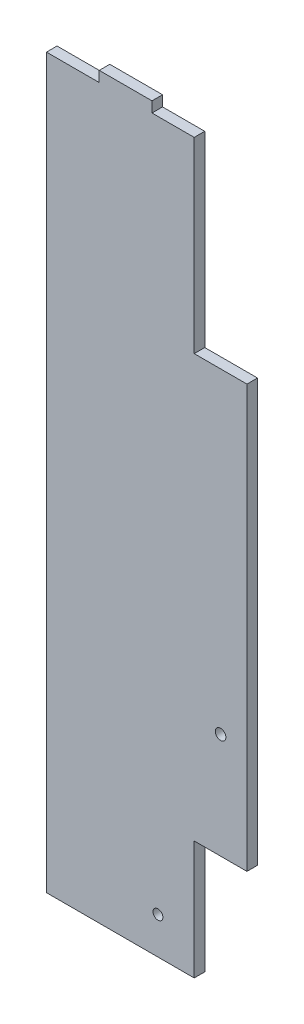
ISO-10303-21;
HEADER;
FILE_DESCRIPTION(('STEP AP214'),'2;1');
FILE_NAME('part.step','',(''),(''),'','','');
FILE_SCHEMA(('AUTOMOTIVE_DESIGN { 1 0 10303 214 1 1 1 1 }'));
ENDSEC;
DATA;
#1=APPLICATION_CONTEXT('core data for automotive mechanical design processes');
#2=APPLICATION_PROTOCOL_DEFINITION('international standard','automotive_design',2000,#1);
#3=PRODUCT_CONTEXT('',#1,'mechanical');
#4=PRODUCT('Part','Part','',(#3));
#5=PRODUCT_RELATED_PRODUCT_CATEGORY('part','',(#4));
#6=PRODUCT_DEFINITION_FORMATION('','',#4);
#7=PRODUCT_DEFINITION_CONTEXT('part definition',#1,'design');
#8=PRODUCT_DEFINITION('design','',#6,#7);
#9=PRODUCT_DEFINITION_SHAPE('','',#8);
#10=(LENGTH_UNIT() NAMED_UNIT(*) SI_UNIT(.MILLI.,.METRE.));
#11=(NAMED_UNIT(*) PLANE_ANGLE_UNIT() SI_UNIT($,.RADIAN.));
#12=(NAMED_UNIT(*) SI_UNIT($,.STERADIAN.) SOLID_ANGLE_UNIT());
#13=UNCERTAINTY_MEASURE_WITH_UNIT(LENGTH_MEASURE(1.E-05),#10,'distance_accuracy_value','');
#14=(GEOMETRIC_REPRESENTATION_CONTEXT(3) GLOBAL_UNCERTAINTY_ASSIGNED_CONTEXT((#13)) GLOBAL_UNIT_ASSIGNED_CONTEXT((#10,
#11,#12)) REPRESENTATION_CONTEXT('',''));
#15=CARTESIAN_POINT('',(0.,0.,0.));
#16=DIRECTION('',(0.,0.,1.));
#17=DIRECTION('',(1.,0.,0.));
#18=AXIS2_PLACEMENT_3D('',#15,#16,#17);
#19=CARTESIAN_POINT('',(0.,136.,4.));
#20=DIRECTION('',(0.,1.,0.));
#21=DIRECTION('',(-1.,0.,0.));
#22=AXIS2_PLACEMENT_3D('',#19,#20,#21);
#23=PLANE('',#22);
#24=DIRECTION('',(1.,0.,0.));
#25=VECTOR('',#24,1.);
#26=CARTESIAN_POINT('',(0.,136.,0.));
#27=LINE('',#26,#25);
#28=CARTESIAN_POINT('',(-40.,136.,0.));
#29=VERTEX_POINT('',#28);
#30=CARTESIAN_POINT('',(-20.,136.,0.));
#31=VERTEX_POINT('',#30);
#32=EDGE_CURVE('E109',#29,#31,#27,.T.);
#33=ORIENTED_EDGE('',*,*,#32,.F.);
#34=DIRECTION('',(0.,0.,-1.));
#35=VECTOR('',#34,1.);
#36=CARTESIAN_POINT('',(-40.,136.,4.));
#37=LINE('',#36,#35);
#38=CARTESIAN_POINT('',(-40.,136.,4.));
#39=VERTEX_POINT('',#38);
#40=EDGE_CURVE('E45',#39,#29,#37,.T.);
#41=ORIENTED_EDGE('',*,*,#40,.F.);
#42=DIRECTION('',(1.,0.,0.));
#43=VECTOR('',#42,1.);
#44=CARTESIAN_POINT('',(0.,136.,4.));
#45=LINE('',#44,#43);
#46=CARTESIAN_POINT('',(-20.,136.,4.));
#47=VERTEX_POINT('',#46);
#48=EDGE_CURVE('E223',#39,#47,#45,.T.);
#49=ORIENTED_EDGE('',*,*,#48,.T.);
#50=DIRECTION('',(0.,0.,-1.));
#51=VECTOR('',#50,1.);
#52=CARTESIAN_POINT('',(-20.,136.,4.));
#53=LINE('',#52,#51);
#54=EDGE_CURVE('E160',#47,#31,#53,.T.);
#55=ORIENTED_EDGE('',*,*,#54,.T.);
#56=EDGE_LOOP('',(#33,#41,#49,#55));
#57=FACE_BOUND('',#56,.T.);
#58=ADVANCED_FACE('F41',(#57),#23,.T.);
#59=CARTESIAN_POINT('',(0.,-140.,4.));
#60=DIRECTION('',(0.,-1.,0.));
#61=DIRECTION('',(0.,0.,-1.));
#62=AXIS2_PLACEMENT_3D('',#59,#60,#61);
#63=PLANE('',#62);
#64=DIRECTION('',(-1.,0.,0.));
#65=VECTOR('',#64,1.);
#66=CARTESIAN_POINT('',(0.,-140.,0.));
#67=LINE('',#66,#65);
#68=CARTESIAN_POINT('',(16.0000000000001,-140.,0.));
#69=VERTEX_POINT('',#68);
#70=CARTESIAN_POINT('',(-39.9999999999999,-140.,0.));
#71=VERTEX_POINT('',#70);
#72=EDGE_CURVE('E115',#69,#71,#67,.T.);
#73=ORIENTED_EDGE('',*,*,#72,.F.);
#74=DIRECTION('',(0.,0.,-1.));
#75=VECTOR('',#74,1.);
#76=CARTESIAN_POINT('',(16.0000000000001,-140.,4.));
#77=LINE('',#76,#75);
#78=CARTESIAN_POINT('',(16.0000000000001,-140.,4.));
#79=VERTEX_POINT('',#78);
#80=EDGE_CURVE('E11',#79,#69,#77,.T.);
#81=ORIENTED_EDGE('',*,*,#80,.F.);
#82=DIRECTION('',(-1.,0.,0.));
#83=VECTOR('',#82,1.);
#84=CARTESIAN_POINT('',(0.,-140.,4.));
#85=LINE('',#84,#83);
#86=CARTESIAN_POINT('',(-39.9999999999999,-140.,4.));
#87=VERTEX_POINT('',#86);
#88=EDGE_CURVE('E131',#79,#87,#85,.T.);
#89=ORIENTED_EDGE('',*,*,#88,.T.);
#90=DIRECTION('',(0.,0.,-1.));
#91=VECTOR('',#90,1.);
#92=CARTESIAN_POINT('',(-39.9999999999999,-140.,4.));
#93=LINE('',#92,#91);
#94=EDGE_CURVE('E128',#87,#71,#93,.T.);
#95=ORIENTED_EDGE('',*,*,#94,.T.);
#96=EDGE_LOOP('',(#73,#81,#89,#95));
#97=FACE_BOUND('',#96,.T.);
#98=ADVANCED_FACE('F129',(#97),#63,.T.);
#99=CARTESIAN_POINT('',(16.,0.,4.));
#100=DIRECTION('',(1.,0.,0.));
#101=DIRECTION('',(0.,1.,0.));
#102=AXIS2_PLACEMENT_3D('',#99,#100,#101);
#103=PLANE('',#102);
#104=DIRECTION('',(0.,-1.,0.));
#105=VECTOR('',#104,1.);
#106=CARTESIAN_POINT('',(16.,0.,0.));
#107=LINE('',#106,#105);
#108=CARTESIAN_POINT('',(16.,-95.,0.));
#109=VERTEX_POINT('',#108);
#110=EDGE_CURVE('E123',#109,#69,#107,.T.);
#111=ORIENTED_EDGE('',*,*,#110,.F.);
#112=DIRECTION('',(0.,0.,-1.));
#113=VECTOR('',#112,1.);
#114=CARTESIAN_POINT('',(16.,-95.,4.));
#115=LINE('',#114,#113);
#116=CARTESIAN_POINT('',(16.,-95.,4.));
#117=VERTEX_POINT('',#116);
#118=EDGE_CURVE('E51',#117,#109,#115,.T.);
#119=ORIENTED_EDGE('',*,*,#118,.F.);
#120=DIRECTION('',(0.,-1.,0.));
#121=VECTOR('',#120,1.);
#122=CARTESIAN_POINT('',(16.,0.,4.));
#123=LINE('',#122,#121);
#124=EDGE_CURVE('E219',#117,#79,#123,.T.);
#125=ORIENTED_EDGE('',*,*,#124,.T.);
#126=ORIENTED_EDGE('',*,*,#80,.T.);
#127=EDGE_LOOP('',(#111,#119,#125,#126));
#128=FACE_BOUND('',#127,.T.);
#129=ADVANCED_FACE('F250',(#128),#103,.T.);
#130=CARTESIAN_POINT('',(0.,-95.,4.));
#131=DIRECTION('',(0.,1.,0.));
#132=DIRECTION('',(0.,0.,1.));
#133=AXIS2_PLACEMENT_3D('',#130,#131,#132);
#134=PLANE('',#133);
#135=DIRECTION('',(1.,0.,0.));
#136=VECTOR('',#135,1.);
#137=CARTESIAN_POINT('',(0.,-95.,0.));
#138=LINE('',#137,#136);
#139=CARTESIAN_POINT('',(36.,-95.,0.));
#140=VERTEX_POINT('',#139);
#141=EDGE_CURVE('E184',#109,#140,#138,.T.);
#142=ORIENTED_EDGE('',*,*,#141,.T.);
#143=DIRECTION('',(0.,0.,-1.));
#144=VECTOR('',#143,1.);
#145=CARTESIAN_POINT('',(36.,-95.,4.));
#146=LINE('',#145,#144);
#147=CARTESIAN_POINT('',(36.,-95.,4.));
#148=VERTEX_POINT('',#147);
#149=EDGE_CURVE('E143',#148,#140,#146,.T.);
#150=ORIENTED_EDGE('',*,*,#149,.F.);
#151=DIRECTION('',(1.,0.,0.));
#152=VECTOR('',#151,1.);
#153=CARTESIAN_POINT('',(0.,-95.,4.));
#154=LINE('',#153,#152);
#155=EDGE_CURVE('E216',#117,#148,#154,.T.);
#156=ORIENTED_EDGE('',*,*,#155,.F.);
#157=ORIENTED_EDGE('',*,*,#118,.T.);
#158=EDGE_LOOP('',(#142,#150,#156,#157));
#159=FACE_BOUND('',#158,.T.);
#160=ADVANCED_FACE('F313',(#159),#134,.F.);
#161=CARTESIAN_POINT('',(36.,0.,4.));
#162=DIRECTION('',(-1.,0.,0.));
#163=DIRECTION('',(0.,0.,1.));
#164=AXIS2_PLACEMENT_3D('',#161,#162,#163);
#165=PLANE('',#164);
#166=DIRECTION('',(0.,1.,0.));
#167=VECTOR('',#166,1.);
#168=CARTESIAN_POINT('',(36.,0.,0.));
#169=LINE('',#168,#167);
#170=CARTESIAN_POINT('',(36.,65.,0.));
#171=VERTEX_POINT('',#170);
#172=EDGE_CURVE('E180',#140,#171,#169,.T.);
#173=ORIENTED_EDGE('',*,*,#172,.T.);
#174=DIRECTION('',(0.,0.,-1.));
#175=VECTOR('',#174,1.);
#176=CARTESIAN_POINT('',(36.,65.,4.));
#177=LINE('',#176,#175);
#178=CARTESIAN_POINT('',(36.,65.,4.));
#179=VERTEX_POINT('',#178);
#180=EDGE_CURVE('E147',#179,#171,#177,.T.);
#181=ORIENTED_EDGE('',*,*,#180,.F.);
#182=DIRECTION('',(0.,1.,0.));
#183=VECTOR('',#182,1.);
#184=CARTESIAN_POINT('',(36.,0.,4.));
#185=LINE('',#184,#183);
#186=EDGE_CURVE('E212',#148,#179,#185,.T.);
#187=ORIENTED_EDGE('',*,*,#186,.F.);
#188=ORIENTED_EDGE('',*,*,#149,.T.);
#189=EDGE_LOOP('',(#173,#181,#187,#188));
#190=FACE_BOUND('',#189,.T.);
#191=ADVANCED_FACE('F317',(#190),#165,.F.);
#192=CARTESIAN_POINT('',(0.,65.,4.));
#193=DIRECTION('',(0.,1.,0.));
#194=DIRECTION('',(0.,0.,1.));
#195=AXIS2_PLACEMENT_3D('',#192,#193,#194);
#196=PLANE('',#195);
#197=DIRECTION('',(1.,0.,0.));
#198=VECTOR('',#197,1.);
#199=CARTESIAN_POINT('',(0.,65.,0.));
#200=LINE('',#199,#198);
#201=CARTESIAN_POINT('',(16.,65.,0.));
#202=VERTEX_POINT('',#201);
#203=EDGE_CURVE('E177',#202,#171,#200,.T.);
#204=ORIENTED_EDGE('',*,*,#203,.F.);
#205=DIRECTION('',(0.,0.,-1.));
#206=VECTOR('',#205,1.);
#207=CARTESIAN_POINT('',(16.,65.,4.));
#208=LINE('',#207,#206);
#209=CARTESIAN_POINT('',(16.,65.,4.));
#210=VERTEX_POINT('',#209);
#211=EDGE_CURVE('E149',#210,#202,#208,.T.);
#212=ORIENTED_EDGE('',*,*,#211,.F.);
#213=DIRECTION('',(1.,0.,0.));
#214=VECTOR('',#213,1.);
#215=CARTESIAN_POINT('',(0.,65.,4.));
#216=LINE('',#215,#214);
#217=EDGE_CURVE('E209',#210,#179,#216,.T.);
#218=ORIENTED_EDGE('',*,*,#217,.T.);
#219=ORIENTED_EDGE('',*,*,#180,.T.);
#220=EDGE_LOOP('',(#204,#212,#218,#219));
#221=FACE_BOUND('',#220,.T.);
#222=ADVANCED_FACE('F320',(#221),#196,.T.);
#223=CARTESIAN_POINT('',(16.,0.,4.));
#224=DIRECTION('',(1.,0.,0.));
#225=DIRECTION('',(0.,1.,0.));
#226=AXIS2_PLACEMENT_3D('',#223,#224,#225);
#227=PLANE('',#226);
#228=DIRECTION('',(0.,-1.,0.));
#229=VECTOR('',#228,1.);
#230=CARTESIAN_POINT('',(16.,0.,0.));
#231=LINE('',#230,#229);
#232=CARTESIAN_POINT('',(16.,136.,0.));
#233=VERTEX_POINT('',#232);
#234=EDGE_CURVE('E173',#233,#202,#231,.T.);
#235=ORIENTED_EDGE('',*,*,#234,.F.);
#236=DIRECTION('',(0.,0.,-1.));
#237=VECTOR('',#236,1.);
#238=CARTESIAN_POINT('',(16.,136.,4.));
#239=LINE('',#238,#237);
#240=CARTESIAN_POINT('',(16.,136.,4.));
#241=VERTEX_POINT('',#240);
#242=EDGE_CURVE('E151',#241,#233,#239,.T.);
#243=ORIENTED_EDGE('',*,*,#242,.F.);
#244=DIRECTION('',(0.,-1.,0.));
#245=VECTOR('',#244,1.);
#246=CARTESIAN_POINT('',(16.,0.,4.));
#247=LINE('',#246,#245);
#248=EDGE_CURVE('E205',#241,#210,#247,.T.);
#249=ORIENTED_EDGE('',*,*,#248,.T.);
#250=ORIENTED_EDGE('',*,*,#211,.T.);
#251=EDGE_LOOP('',(#235,#243,#249,#250));
#252=FACE_BOUND('',#251,.T.);
#253=ADVANCED_FACE('F256',(#252),#227,.T.);
#254=CARTESIAN_POINT('',(0.,136.,0.));
#255=VERTEX_POINT('',#254);
#256=EDGE_CURVE('E172',#255,#233,#27,.T.);
#257=ORIENTED_EDGE('',*,*,#256,.F.);
#258=DIRECTION('',(0.,0.,-1.));
#259=VECTOR('',#258,1.);
#260=CARTESIAN_POINT('',(0.,136.,4.));
#261=LINE('',#260,#259);
#262=CARTESIAN_POINT('',(0.,136.,4.));
#263=VERTEX_POINT('',#262);
#264=EDGE_CURVE('E153',#263,#255,#261,.T.);
#265=ORIENTED_EDGE('',*,*,#264,.F.);
#266=EDGE_CURVE('E204',#263,#241,#45,.T.);
#267=ORIENTED_EDGE('',*,*,#266,.T.);
#268=ORIENTED_EDGE('',*,*,#242,.T.);
#269=EDGE_LOOP('',(#257,#265,#267,#268));
#270=FACE_BOUND('',#269,.T.);
#271=ADVANCED_FACE('F246',(#270),#23,.T.);
#272=CARTESIAN_POINT('',(0.,0.,4.));
#273=DIRECTION('',(1.,0.,0.));
#274=DIRECTION('',(0.,1.,0.));
#275=AXIS2_PLACEMENT_3D('',#272,#273,#274);
#276=PLANE('',#275);
#277=DIRECTION('',(0.,-1.,0.));
#278=VECTOR('',#277,1.);
#279=CARTESIAN_POINT('',(0.,0.,0.));
#280=LINE('',#279,#278);
#281=CARTESIAN_POINT('',(0.,140.,0.));
#282=VERTEX_POINT('',#281);
#283=EDGE_CURVE('E169',#282,#255,#280,.T.);
#284=ORIENTED_EDGE('',*,*,#283,.F.);
#285=DIRECTION('',(0.,0.,-1.));
#286=VECTOR('',#285,1.);
#287=CARTESIAN_POINT('',(0.,140.,4.));
#288=LINE('',#287,#286);
#289=CARTESIAN_POINT('',(0.,140.,4.));
#290=VERTEX_POINT('',#289);
#291=EDGE_CURVE('E155',#290,#282,#288,.T.);
#292=ORIENTED_EDGE('',*,*,#291,.F.);
#293=DIRECTION('',(0.,-1.,0.));
#294=VECTOR('',#293,1.);
#295=CARTESIAN_POINT('',(0.,0.,4.));
#296=LINE('',#295,#294);
#297=EDGE_CURVE('E201',#290,#263,#296,.T.);
#298=ORIENTED_EDGE('',*,*,#297,.T.);
#299=ORIENTED_EDGE('',*,*,#264,.T.);
#300=EDGE_LOOP('',(#284,#292,#298,#299));
#301=FACE_BOUND('',#300,.T.);
#302=ADVANCED_FACE('F255',(#301),#276,.T.);
#303=CARTESIAN_POINT('',(0.,140.,4.));
#304=DIRECTION('',(0.,-1.,0.));
#305=DIRECTION('',(0.,0.,-1.));
#306=AXIS2_PLACEMENT_3D('',#303,#304,#305);
#307=PLANE('',#306);
#308=DIRECTION('',(-1.,0.,0.));
#309=VECTOR('',#308,1.);
#310=CARTESIAN_POINT('',(0.,140.,0.));
#311=LINE('',#310,#309);
#312=CARTESIAN_POINT('',(-20.,140.,0.));
#313=VERTEX_POINT('',#312);
#314=EDGE_CURVE('E166',#282,#313,#311,.T.);
#315=ORIENTED_EDGE('',*,*,#314,.T.);
#316=DIRECTION('',(0.,0.,-1.));
#317=VECTOR('',#316,1.);
#318=CARTESIAN_POINT('',(-20.,140.,4.));
#319=LINE('',#318,#317);
#320=CARTESIAN_POINT('',(-20.,140.,4.));
#321=VERTEX_POINT('',#320);
#322=EDGE_CURVE('E157',#321,#313,#319,.T.);
#323=ORIENTED_EDGE('',*,*,#322,.F.);
#324=DIRECTION('',(-1.,0.,0.));
#325=VECTOR('',#324,1.);
#326=CARTESIAN_POINT('',(0.,140.,4.));
#327=LINE('',#326,#325);
#328=EDGE_CURVE('E199',#290,#321,#327,.T.);
#329=ORIENTED_EDGE('',*,*,#328,.F.);
#330=ORIENTED_EDGE('',*,*,#291,.T.);
#331=EDGE_LOOP('',(#315,#323,#329,#330));
#332=FACE_BOUND('',#331,.T.);
#333=ADVANCED_FACE('F271',(#332),#307,.F.);
#334=CARTESIAN_POINT('',(26.,-55.,4.));
#335=DIRECTION('',(0.,0.,-1.));
#336=DIRECTION('',(-1.,0.,0.));
#337=AXIS2_PLACEMENT_3D('',#334,#335,#336);
#338=CYLINDRICAL_SURFACE('',#337,2.);
#339=CARTESIAN_POINT('',(26.,-55.,4.));
#340=DIRECTION('',(0.,0.,1.));
#341=DIRECTION('',(1.,0.,0.));
#342=AXIS2_PLACEMENT_3D('',#339,#340,#341);
#343=CIRCLE('',#342,2.);
#344=CARTESIAN_POINT('',(28.,-55.,4.));
#345=VERTEX_POINT('',#344);
#346=EDGE_CURVE('E227',#345,#345,#343,.T.);
#347=ORIENTED_EDGE('',*,*,#346,.T.);
#348=EDGE_LOOP('',(#347));
#349=FACE_BOUND('',#348,.T.);
#350=CARTESIAN_POINT('',(26.,-55.,0.));
#351=DIRECTION('',(0.,0.,1.));
#352=DIRECTION('',(1.,0.,0.));
#353=AXIS2_PLACEMENT_3D('',#350,#351,#352);
#354=CIRCLE('',#353,2.);
#355=CARTESIAN_POINT('',(28.,-55.,0.));
#356=VERTEX_POINT('',#355);
#357=EDGE_CURVE('E191',#356,#356,#354,.T.);
#358=ORIENTED_EDGE('',*,*,#357,.F.);
#359=EDGE_LOOP('',(#358));
#360=FACE_BOUND('',#359,.T.);
#361=ADVANCED_FACE('F273',(#349,#360),#338,.F.);
#362=CARTESIAN_POINT('',(2.26398699164165,-126.02409254025,4.));
#363=DIRECTION('',(0.,0.,-1.));
#364=DIRECTION('',(-1.,0.,0.));
#365=AXIS2_PLACEMENT_3D('',#362,#363,#364);
#366=CYLINDRICAL_SURFACE('',#365,1.86418977264107);
#367=CARTESIAN_POINT('',(2.26398699164165,-126.02409254025,4.));
#368=DIRECTION('',(0.,0.,1.));
#369=DIRECTION('',(1.,0.,0.));
#370=AXIS2_PLACEMENT_3D('',#367,#368,#369);
#371=CIRCLE('',#370,1.86418977264107);
#372=CARTESIAN_POINT('',(4.12817676428272,-126.02409254025,4.));
#373=VERTEX_POINT('',#372);
#374=EDGE_CURVE('E165',#373,#373,#371,.T.);
#375=ORIENTED_EDGE('',*,*,#374,.T.);
#376=EDGE_LOOP('',(#375));
#377=FACE_BOUND('',#376,.T.);
#378=CARTESIAN_POINT('',(2.26398699164165,-126.02409254025,0.));
#379=DIRECTION('',(0.,0.,1.));
#380=DIRECTION('',(1.,0.,0.));
#381=AXIS2_PLACEMENT_3D('',#378,#379,#380);
#382=CIRCLE('',#381,1.86418977264107);
#383=CARTESIAN_POINT('',(4.12817676428272,-126.02409254025,0.));
#384=VERTEX_POINT('',#383);
#385=EDGE_CURVE('E195',#384,#384,#382,.T.);
#386=ORIENTED_EDGE('',*,*,#385,.F.);
#387=EDGE_LOOP('',(#386));
#388=FACE_BOUND('',#387,.T.);
#389=ADVANCED_FACE('F234',(#377,#388),#366,.F.);
#390=CARTESIAN_POINT('',(-20.,0.,4.));
#391=DIRECTION('',(1.,0.,0.));
#392=DIRECTION('',(0.,0.,-1.));
#393=AXIS2_PLACEMENT_3D('',#390,#391,#392);
#394=PLANE('',#393);
#395=DIRECTION('',(0.,-1.,0.));
#396=VECTOR('',#395,1.);
#397=CARTESIAN_POINT('',(-20.,0.,0.));
#398=LINE('',#397,#396);
#399=EDGE_CURVE('E162',#313,#31,#398,.T.);
#400=ORIENTED_EDGE('',*,*,#399,.T.);
#401=ORIENTED_EDGE('',*,*,#54,.F.);
#402=DIRECTION('',(0.,-1.,0.));
#403=VECTOR('',#402,1.);
#404=CARTESIAN_POINT('',(-20.,0.,4.));
#405=LINE('',#404,#403);
#406=EDGE_CURVE('E60',#321,#47,#405,.T.);
#407=ORIENTED_EDGE('',*,*,#406,.F.);
#408=ORIENTED_EDGE('',*,*,#322,.T.);
#409=EDGE_LOOP('',(#400,#401,#407,#408));
#410=FACE_BOUND('',#409,.T.);
#411=ADVANCED_FACE('F240',(#410),#394,.F.);
#412=CARTESIAN_POINT('',(0.,0.,4.));
#413=DIRECTION('',(0.,0.,1.));
#414=DIRECTION('',(1.,0.,0.));
#415=AXIS2_PLACEMENT_3D('',#412,#413,#414);
#416=PLANE('',#415);
#417=ORIENTED_EDGE('',*,*,#374,.F.);
#418=EDGE_LOOP('',(#417));
#419=FACE_BOUND('',#418,.T.);
#420=ORIENTED_EDGE('',*,*,#346,.F.);
#421=EDGE_LOOP('',(#420));
#422=FACE_BOUND('',#421,.T.);
#423=ORIENTED_EDGE('',*,*,#48,.F.);
#424=DIRECTION('',(0.,-1.,0.));
#425=VECTOR('',#424,1.);
#426=CARTESIAN_POINT('',(-40.,136.,4.));
#427=LINE('',#426,#425);
#428=EDGE_CURVE('E135',#39,#87,#427,.T.);
#429=ORIENTED_EDGE('',*,*,#428,.T.);
#430=ORIENTED_EDGE('',*,*,#88,.F.);
#431=ORIENTED_EDGE('',*,*,#124,.F.);
#432=ORIENTED_EDGE('',*,*,#155,.T.);
#433=ORIENTED_EDGE('',*,*,#186,.T.);
#434=ORIENTED_EDGE('',*,*,#217,.F.);
#435=ORIENTED_EDGE('',*,*,#248,.F.);
#436=ORIENTED_EDGE('',*,*,#266,.F.);
#437=ORIENTED_EDGE('',*,*,#297,.F.);
#438=ORIENTED_EDGE('',*,*,#328,.T.);
#439=ORIENTED_EDGE('',*,*,#406,.T.);
#440=EDGE_LOOP('',(#423,#429,#430,#431,#432,#433,#434,#435,#436,#437,#438,#439));
#441=FACE_BOUND('',#440,.T.);
#442=ADVANCED_FACE('F237',(#419,#422,#441),#416,.T.);
#443=CARTESIAN_POINT('',(0.,0.,0.));
#444=DIRECTION('',(0.,0.,1.));
#445=DIRECTION('',(1.,0.,0.));
#446=AXIS2_PLACEMENT_3D('',#443,#444,#445);
#447=PLANE('',#446);
#448=ORIENTED_EDGE('',*,*,#385,.T.);
#449=EDGE_LOOP('',(#448));
#450=FACE_BOUND('',#449,.T.);
#451=ORIENTED_EDGE('',*,*,#357,.T.);
#452=EDGE_LOOP('',(#451));
#453=FACE_BOUND('',#452,.T.);
#454=ORIENTED_EDGE('',*,*,#32,.T.);
#455=ORIENTED_EDGE('',*,*,#399,.F.);
#456=ORIENTED_EDGE('',*,*,#314,.F.);
#457=ORIENTED_EDGE('',*,*,#283,.T.);
#458=ORIENTED_EDGE('',*,*,#256,.T.);
#459=ORIENTED_EDGE('',*,*,#234,.T.);
#460=ORIENTED_EDGE('',*,*,#203,.T.);
#461=ORIENTED_EDGE('',*,*,#172,.F.);
#462=ORIENTED_EDGE('',*,*,#141,.F.);
#463=ORIENTED_EDGE('',*,*,#110,.T.);
#464=ORIENTED_EDGE('',*,*,#72,.T.);
#465=DIRECTION('',(0.,-1.,0.));
#466=VECTOR('',#465,1.);
#467=CARTESIAN_POINT('',(-40.,136.,0.));
#468=LINE('',#467,#466);
#469=EDGE_CURVE('E119',#29,#71,#468,.T.);
#470=ORIENTED_EDGE('',*,*,#469,.F.);
#471=EDGE_LOOP('',(#454,#455,#456,#457,#458,#459,#460,#461,#462,#463,#464,#470));
#472=FACE_BOUND('',#471,.T.);
#473=ADVANCED_FACE('F117',(#450,#453,#472),#447,.F.);
#474=CARTESIAN_POINT('',(-40.,136.,4.));
#475=DIRECTION('',(1.,0.,0.));
#476=DIRECTION('',(0.,1.,0.));
#477=AXIS2_PLACEMENT_3D('',#474,#475,#476);
#478=PLANE('',#477);
#479=ORIENTED_EDGE('',*,*,#469,.T.);
#480=ORIENTED_EDGE('',*,*,#94,.F.);
#481=ORIENTED_EDGE('',*,*,#428,.F.);
#482=ORIENTED_EDGE('',*,*,#40,.T.);
#483=EDGE_LOOP('',(#479,#480,#481,#482));
#484=FACE_BOUND('',#483,.T.);
#485=ADVANCED_FACE('F43',(#484),#478,.F.);
#486=CLOSED_SHELL('',(#58,#98,#129,#160,#191,#222,#253,#271,#302,#333,#361,#389,#411,#442,#473,#485));
#487=MANIFOLD_SOLID_BREP('B2',#486);
#488=ADVANCED_BREP_SHAPE_REPRESENTATION('',(#18,#487),#14);
#489=SHAPE_DEFINITION_REPRESENTATION(#9,#488);
ENDSEC;
END-ISO-10303-21;
